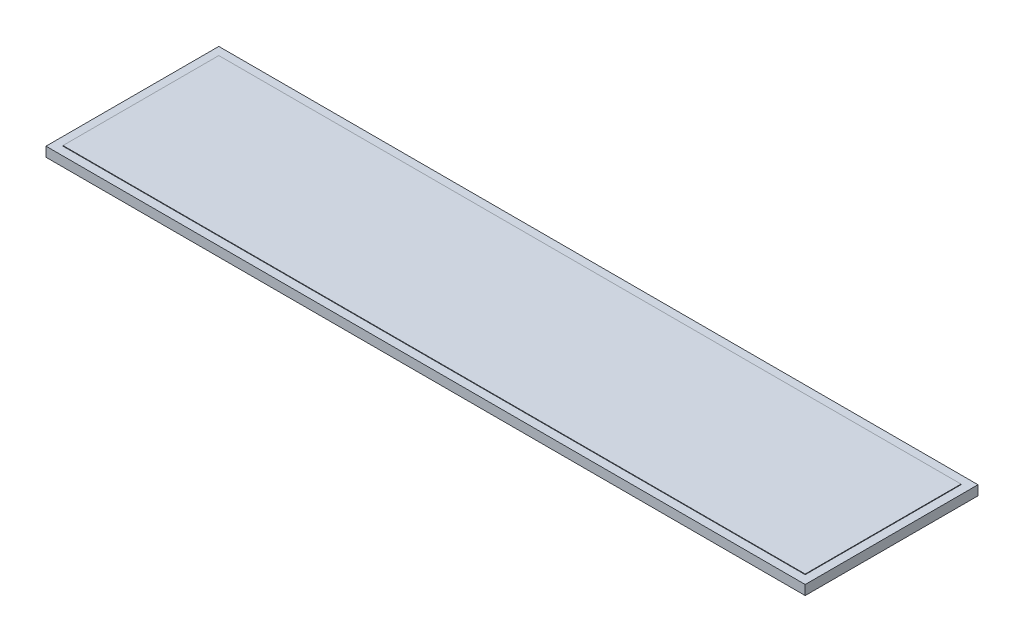
ISO-10303-21;
HEADER;
FILE_DESCRIPTION(('STEP AP214'),'2;1');
FILE_NAME('part.step','',(''),(''),'','','');
FILE_SCHEMA(('AUTOMOTIVE_DESIGN { 1 0 10303 214 1 1 1 1 }'));
ENDSEC;
DATA;
#1=APPLICATION_CONTEXT('core data for automotive mechanical design processes');
#2=APPLICATION_PROTOCOL_DEFINITION('international standard','automotive_design',2000,#1);
#3=PRODUCT_CONTEXT('',#1,'mechanical');
#4=PRODUCT('Part','Part','',(#3));
#5=PRODUCT_RELATED_PRODUCT_CATEGORY('part','',(#4));
#6=PRODUCT_DEFINITION_FORMATION('','',#4);
#7=PRODUCT_DEFINITION_CONTEXT('part definition',#1,'design');
#8=PRODUCT_DEFINITION('design','',#6,#7);
#9=PRODUCT_DEFINITION_SHAPE('','',#8);
#10=(LENGTH_UNIT() NAMED_UNIT(*) SI_UNIT(.MILLI.,.METRE.));
#11=(NAMED_UNIT(*) PLANE_ANGLE_UNIT() SI_UNIT($,.RADIAN.));
#12=(NAMED_UNIT(*) SI_UNIT($,.STERADIAN.) SOLID_ANGLE_UNIT());
#13=UNCERTAINTY_MEASURE_WITH_UNIT(LENGTH_MEASURE(1.E-05),#10,'distance_accuracy_value','');
#14=(GEOMETRIC_REPRESENTATION_CONTEXT(3) GLOBAL_UNCERTAINTY_ASSIGNED_CONTEXT((#13)) GLOBAL_UNIT_ASSIGNED_CONTEXT((#10,
#11,#12)) REPRESENTATION_CONTEXT('',''));
#15=CARTESIAN_POINT('',(0.,0.,0.));
#16=DIRECTION('',(0.,0.,1.));
#17=DIRECTION('',(1.,0.,0.));
#18=AXIS2_PLACEMENT_3D('',#15,#16,#17);
#19=CARTESIAN_POINT('',(67.,-1.8,-15.25));
#20=DIRECTION('',(1.,0.,0.));
#21=DIRECTION('',(0.,0.,-1.));
#22=AXIS2_PLACEMENT_3D('',#19,#20,#21);
#23=PLANE('',#22);
#24=DIRECTION('',(0.,1.,0.));
#25=VECTOR('',#24,1.);
#26=CARTESIAN_POINT('',(67.,-1.8,-15.25));
#27=LINE('',#26,#25);
#28=CARTESIAN_POINT('',(67.,-1.8,-15.25));
#29=VERTEX_POINT('',#28);
#30=CARTESIAN_POINT('',(67.,-0.1,-15.25));
#31=VERTEX_POINT('',#30);
#32=EDGE_CURVE('E186',#29,#31,#27,.T.);
#33=ORIENTED_EDGE('',*,*,#32,.T.);
#34=DIRECTION('',(0.,0.,1.));
#35=VECTOR('',#34,1.);
#36=CARTESIAN_POINT('',(67.,-0.1,-15.25));
#37=LINE('',#36,#35);
#38=CARTESIAN_POINT('',(67.,-0.1,15.25));
#39=VERTEX_POINT('',#38);
#40=EDGE_CURVE('E55',#31,#39,#37,.T.);
#41=ORIENTED_EDGE('',*,*,#40,.T.);
#42=DIRECTION('',(0.,1.,0.));
#43=VECTOR('',#42,1.);
#44=CARTESIAN_POINT('',(67.,-1.8,15.25));
#45=LINE('',#44,#43);
#46=CARTESIAN_POINT('',(67.,-1.8,15.25));
#47=VERTEX_POINT('',#46);
#48=EDGE_CURVE('E48',#47,#39,#45,.T.);
#49=ORIENTED_EDGE('',*,*,#48,.F.);
#50=DIRECTION('',(0.,0.,-1.));
#51=VECTOR('',#50,1.);
#52=CARTESIAN_POINT('',(67.,-1.8,-15.25));
#53=LINE('',#52,#51);
#54=EDGE_CURVE('E170',#47,#29,#53,.T.);
#55=ORIENTED_EDGE('',*,*,#54,.T.);
#56=EDGE_LOOP('',(#33,#41,#49,#55));
#57=FACE_BOUND('',#56,.T.);
#58=ADVANCED_FACE('F40',(#57),#23,.T.);
#59=CARTESIAN_POINT('',(-67.,-1.8,15.25));
#60=DIRECTION('',(0.,0.,1.));
#61=DIRECTION('',(1.,0.,0.));
#62=AXIS2_PLACEMENT_3D('',#59,#60,#61);
#63=PLANE('',#62);
#64=ORIENTED_EDGE('',*,*,#48,.T.);
#65=DIRECTION('',(-1.,0.,0.));
#66=VECTOR('',#65,1.);
#67=CARTESIAN_POINT('',(-67.,-0.1,15.25));
#68=LINE('',#67,#66);
#69=CARTESIAN_POINT('',(-67.,-0.1,15.25));
#70=VERTEX_POINT('',#69);
#71=EDGE_CURVE('E165',#39,#70,#68,.T.);
#72=ORIENTED_EDGE('',*,*,#71,.T.);
#73=DIRECTION('',(0.,1.,0.));
#74=VECTOR('',#73,1.);
#75=CARTESIAN_POINT('',(-67.,-1.8,15.25));
#76=LINE('',#75,#74);
#77=CARTESIAN_POINT('',(-67.,-1.8,15.25));
#78=VERTEX_POINT('',#77);
#79=EDGE_CURVE('E189',#78,#70,#76,.T.);
#80=ORIENTED_EDGE('',*,*,#79,.F.);
#81=DIRECTION('',(1.,0.,0.));
#82=VECTOR('',#81,1.);
#83=CARTESIAN_POINT('',(-67.,-1.8,15.25));
#84=LINE('',#83,#82);
#85=EDGE_CURVE('E182',#78,#47,#84,.T.);
#86=ORIENTED_EDGE('',*,*,#85,.T.);
#87=EDGE_LOOP('',(#64,#72,#80,#86));
#88=FACE_BOUND('',#87,.T.);
#89=ADVANCED_FACE('F210',(#88),#63,.T.);
#90=CARTESIAN_POINT('',(-67.,-1.8,-15.25));
#91=DIRECTION('',(-1.,0.,0.));
#92=DIRECTION('',(0.,0.,1.));
#93=AXIS2_PLACEMENT_3D('',#90,#91,#92);
#94=PLANE('',#93);
#95=ORIENTED_EDGE('',*,*,#79,.T.);
#96=DIRECTION('',(0.,0.,-1.));
#97=VECTOR('',#96,1.);
#98=CARTESIAN_POINT('',(-67.,-0.1,-15.25));
#99=LINE('',#98,#97);
#100=CARTESIAN_POINT('',(-67.,-0.1,-15.25));
#101=VERTEX_POINT('',#100);
#102=EDGE_CURVE('E157',#70,#101,#99,.T.);
#103=ORIENTED_EDGE('',*,*,#102,.T.);
#104=DIRECTION('',(0.,1.,0.));
#105=VECTOR('',#104,1.);
#106=CARTESIAN_POINT('',(-67.,-1.8,-15.25));
#107=LINE('',#106,#105);
#108=CARTESIAN_POINT('',(-67.,-1.8,-15.25));
#109=VERTEX_POINT('',#108);
#110=EDGE_CURVE('E193',#109,#101,#107,.T.);
#111=ORIENTED_EDGE('',*,*,#110,.F.);
#112=DIRECTION('',(0.,0.,1.));
#113=VECTOR('',#112,1.);
#114=CARTESIAN_POINT('',(-67.,-1.8,-15.25));
#115=LINE('',#114,#113);
#116=EDGE_CURVE('E178',#109,#78,#115,.T.);
#117=ORIENTED_EDGE('',*,*,#116,.T.);
#118=EDGE_LOOP('',(#95,#103,#111,#117));
#119=FACE_BOUND('',#118,.T.);
#120=ADVANCED_FACE('F208',(#119),#94,.T.);
#121=CARTESIAN_POINT('',(-67.,-1.8,-15.25));
#122=DIRECTION('',(0.,0.,-1.));
#123=DIRECTION('',(-1.,0.,0.));
#124=AXIS2_PLACEMENT_3D('',#121,#122,#123);
#125=PLANE('',#124);
#126=ORIENTED_EDGE('',*,*,#110,.T.);
#127=DIRECTION('',(1.,0.,0.));
#128=VECTOR('',#127,1.);
#129=CARTESIAN_POINT('',(-67.,-0.1,-15.25));
#130=LINE('',#129,#128);
#131=EDGE_CURVE('E12',#101,#31,#130,.T.);
#132=ORIENTED_EDGE('',*,*,#131,.T.);
#133=ORIENTED_EDGE('',*,*,#32,.F.);
#134=DIRECTION('',(-1.,0.,0.));
#135=VECTOR('',#134,1.);
#136=CARTESIAN_POINT('',(-67.,-1.8,-15.25));
#137=LINE('',#136,#135);
#138=EDGE_CURVE('E174',#29,#109,#137,.T.);
#139=ORIENTED_EDGE('',*,*,#138,.T.);
#140=EDGE_LOOP('',(#126,#132,#133,#139));
#141=FACE_BOUND('',#140,.T.);
#142=ADVANCED_FACE('F202',(#141),#125,.T.);
#143=CARTESIAN_POINT('',(0.,-1.8,0.));
#144=DIRECTION('',(0.,1.,0.));
#145=DIRECTION('',(0.,0.,1.));
#146=AXIS2_PLACEMENT_3D('',#143,#144,#145);
#147=PLANE('',#146);
#148=ORIENTED_EDGE('',*,*,#54,.F.);
#149=ORIENTED_EDGE('',*,*,#85,.F.);
#150=ORIENTED_EDGE('',*,*,#116,.F.);
#151=ORIENTED_EDGE('',*,*,#138,.F.);
#152=EDGE_LOOP('',(#148,#149,#150,#151));
#153=FACE_BOUND('',#152,.T.);
#154=ADVANCED_FACE('F205',(#153),#147,.F.);
#155=CARTESIAN_POINT('',(0.,-0.1,0.));
#156=DIRECTION('',(0.,1.,0.));
#157=DIRECTION('',(0.,0.,1.));
#158=AXIS2_PLACEMENT_3D('',#155,#156,#157);
#159=PLANE('',#158);
#160=ORIENTED_EDGE('',*,*,#131,.F.);
#161=ORIENTED_EDGE('',*,*,#102,.F.);
#162=ORIENTED_EDGE('',*,*,#71,.F.);
#163=ORIENTED_EDGE('',*,*,#40,.F.);
#164=EDGE_LOOP('',(#160,#161,#162,#163));
#165=FACE_BOUND('',#164,.T.);
#166=DIRECTION('',(0.,0.,-1.));
#167=VECTOR('',#166,1.);
#168=CARTESIAN_POINT('',(65.5,-0.1,13.75));
#169=LINE('',#168,#167);
#170=CARTESIAN_POINT('',(65.5,-0.1,13.75));
#171=VERTEX_POINT('',#170);
#172=CARTESIAN_POINT('',(65.5,-0.1,-13.75));
#173=VERTEX_POINT('',#172);
#174=EDGE_CURVE('E126',#171,#173,#169,.T.);
#175=ORIENTED_EDGE('',*,*,#174,.F.);
#176=DIRECTION('',(1.,0.,0.));
#177=VECTOR('',#176,1.);
#178=CARTESIAN_POINT('',(-65.5,-0.1,13.75));
#179=LINE('',#178,#177);
#180=CARTESIAN_POINT('',(-65.5,-0.1,13.75));
#181=VERTEX_POINT('',#180);
#182=EDGE_CURVE('E135',#181,#171,#179,.T.);
#183=ORIENTED_EDGE('',*,*,#182,.F.);
#184=DIRECTION('',(0.,0.,1.));
#185=VECTOR('',#184,1.);
#186=CARTESIAN_POINT('',(-65.5,-0.1,-13.75));
#187=LINE('',#186,#185);
#188=CARTESIAN_POINT('',(-65.5,-0.1,-13.75));
#189=VERTEX_POINT('',#188);
#190=EDGE_CURVE('E117',#189,#181,#187,.T.);
#191=ORIENTED_EDGE('',*,*,#190,.F.);
#192=DIRECTION('',(-1.,0.,0.));
#193=VECTOR('',#192,1.);
#194=CARTESIAN_POINT('',(65.5,-0.1,-13.75));
#195=LINE('',#194,#193);
#196=EDGE_CURVE('E132',#173,#189,#195,.T.);
#197=ORIENTED_EDGE('',*,*,#196,.F.);
#198=EDGE_LOOP('',(#175,#183,#191,#197));
#199=FACE_BOUND('',#198,.T.);
#200=ADVANCED_FACE('F131',(#165,#199),#159,.T.);
#201=CARTESIAN_POINT('',(65.5,-0.1,-13.75));
#202=DIRECTION('',(0.,0.,-1.));
#203=DIRECTION('',(-1.,0.,0.));
#204=AXIS2_PLACEMENT_3D('',#201,#202,#203);
#205=PLANE('',#204);
#206=DIRECTION('',(-1.,0.,0.));
#207=VECTOR('',#206,1.);
#208=CARTESIAN_POINT('',(65.5,0.,-13.75));
#209=LINE('',#208,#207);
#210=CARTESIAN_POINT('',(65.5,0.,-13.75));
#211=VERTEX_POINT('',#210);
#212=CARTESIAN_POINT('',(-65.5,0.,-13.75));
#213=VERTEX_POINT('',#212);
#214=EDGE_CURVE('E150',#211,#213,#209,.T.);
#215=ORIENTED_EDGE('',*,*,#214,.F.);
#216=DIRECTION('',(0.,1.,0.));
#217=VECTOR('',#216,1.);
#218=CARTESIAN_POINT('',(65.5,-0.1,-13.75));
#219=LINE('',#218,#217);
#220=EDGE_CURVE('E139',#173,#211,#219,.T.);
#221=ORIENTED_EDGE('',*,*,#220,.F.);
#222=ORIENTED_EDGE('',*,*,#196,.T.);
#223=DIRECTION('',(0.,1.,0.));
#224=VECTOR('',#223,1.);
#225=CARTESIAN_POINT('',(-65.5,-0.1,-13.75));
#226=LINE('',#225,#224);
#227=EDGE_CURVE('E114',#189,#213,#226,.T.);
#228=ORIENTED_EDGE('',*,*,#227,.T.);
#229=EDGE_LOOP('',(#215,#221,#222,#228));
#230=FACE_BOUND('',#229,.T.);
#231=ADVANCED_FACE('F138',(#230),#205,.T.);
#232=CARTESIAN_POINT('',(65.5,-0.1,13.75));
#233=DIRECTION('',(1.,0.,0.));
#234=DIRECTION('',(0.,0.,-1.));
#235=AXIS2_PLACEMENT_3D('',#232,#233,#234);
#236=PLANE('',#235);
#237=DIRECTION('',(0.,0.,-1.));
#238=VECTOR('',#237,1.);
#239=CARTESIAN_POINT('',(65.5,0.,13.75));
#240=LINE('',#239,#238);
#241=CARTESIAN_POINT('',(65.5,0.,13.75));
#242=VERTEX_POINT('',#241);
#243=EDGE_CURVE('E141',#242,#211,#240,.T.);
#244=ORIENTED_EDGE('',*,*,#243,.F.);
#245=DIRECTION('',(0.,1.,0.));
#246=VECTOR('',#245,1.);
#247=CARTESIAN_POINT('',(65.5,-0.1,13.75));
#248=LINE('',#247,#246);
#249=EDGE_CURVE('E158',#171,#242,#248,.T.);
#250=ORIENTED_EDGE('',*,*,#249,.F.);
#251=ORIENTED_EDGE('',*,*,#174,.T.);
#252=ORIENTED_EDGE('',*,*,#220,.T.);
#253=EDGE_LOOP('',(#244,#250,#251,#252));
#254=FACE_BOUND('',#253,.T.);
#255=ADVANCED_FACE('F232',(#254),#236,.T.);
#256=CARTESIAN_POINT('',(-65.5,-0.1,13.75));
#257=DIRECTION('',(0.,0.,1.));
#258=DIRECTION('',(1.,0.,0.));
#259=AXIS2_PLACEMENT_3D('',#256,#257,#258);
#260=PLANE('',#259);
#261=DIRECTION('',(1.,0.,0.));
#262=VECTOR('',#261,1.);
#263=CARTESIAN_POINT('',(-65.5,0.,13.75));
#264=LINE('',#263,#262);
#265=CARTESIAN_POINT('',(-65.5,0.,13.75));
#266=VERTEX_POINT('',#265);
#267=EDGE_CURVE('E64',#266,#242,#264,.T.);
#268=ORIENTED_EDGE('',*,*,#267,.F.);
#269=DIRECTION('',(0.,1.,0.));
#270=VECTOR('',#269,1.);
#271=CARTESIAN_POINT('',(-65.5,-0.1,13.75));
#272=LINE('',#271,#270);
#273=EDGE_CURVE('E125',#181,#266,#272,.T.);
#274=ORIENTED_EDGE('',*,*,#273,.F.);
#275=ORIENTED_EDGE('',*,*,#182,.T.);
#276=ORIENTED_EDGE('',*,*,#249,.T.);
#277=EDGE_LOOP('',(#268,#274,#275,#276));
#278=FACE_BOUND('',#277,.T.);
#279=ADVANCED_FACE('F235',(#278),#260,.T.);
#280=CARTESIAN_POINT('',(-65.5,-0.1,-13.75));
#281=DIRECTION('',(-1.,0.,0.));
#282=DIRECTION('',(0.,0.,1.));
#283=AXIS2_PLACEMENT_3D('',#280,#281,#282);
#284=PLANE('',#283);
#285=DIRECTION('',(0.,0.,1.));
#286=VECTOR('',#285,1.);
#287=CARTESIAN_POINT('',(-65.5,0.,-13.75));
#288=LINE('',#287,#286);
#289=EDGE_CURVE('E119',#213,#266,#288,.T.);
#290=ORIENTED_EDGE('',*,*,#289,.F.);
#291=ORIENTED_EDGE('',*,*,#227,.F.);
#292=ORIENTED_EDGE('',*,*,#190,.T.);
#293=ORIENTED_EDGE('',*,*,#273,.T.);
#294=EDGE_LOOP('',(#290,#291,#292,#293));
#295=FACE_BOUND('',#294,.T.);
#296=ADVANCED_FACE('F116',(#295),#284,.T.);
#297=CARTESIAN_POINT('',(0.,0.,0.));
#298=DIRECTION('',(0.,1.,0.));
#299=DIRECTION('',(0.,0.,1.));
#300=AXIS2_PLACEMENT_3D('',#297,#298,#299);
#301=PLANE('',#300);
#302=ORIENTED_EDGE('',*,*,#243,.T.);
#303=ORIENTED_EDGE('',*,*,#214,.T.);
#304=ORIENTED_EDGE('',*,*,#289,.T.);
#305=ORIENTED_EDGE('',*,*,#267,.T.);
#306=EDGE_LOOP('',(#302,#303,#304,#305));
#307=FACE_BOUND('',#306,.T.);
#308=ADVANCED_FACE('F219',(#307),#301,.T.);
#309=CLOSED_SHELL('',(#58,#89,#120,#142,#154,#200,#231,#255,#279,#296,#308));
#310=MANIFOLD_SOLID_BREP('B2',#309);
#311=ADVANCED_BREP_SHAPE_REPRESENTATION('',(#18,#310),#14);
#312=SHAPE_DEFINITION_REPRESENTATION(#9,#311);
ENDSEC;
END-ISO-10303-21;
